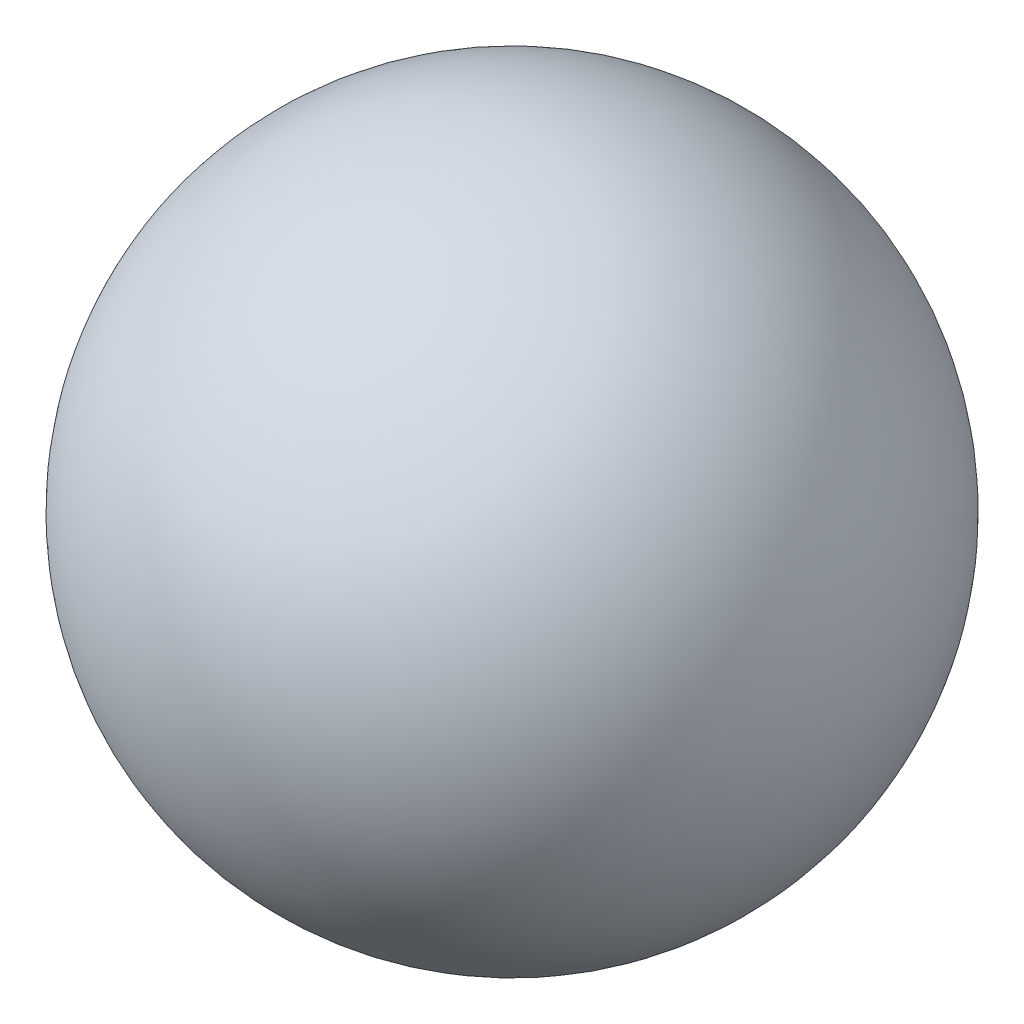
ISO-10303-21;
HEADER;
FILE_DESCRIPTION(('STEP AP214'),'2;1');
FILE_NAME('part.step','',(''),(''),'','','');
FILE_SCHEMA(('AUTOMOTIVE_DESIGN { 1 0 10303 214 1 1 1 1 }'));
ENDSEC;
DATA;
#1=APPLICATION_CONTEXT('core data for automotive mechanical design processes');
#2=APPLICATION_PROTOCOL_DEFINITION('international standard','automotive_design',2000,#1);
#3=PRODUCT_CONTEXT('',#1,'mechanical');
#4=PRODUCT('Part','Part','',(#3));
#5=PRODUCT_RELATED_PRODUCT_CATEGORY('part','',(#4));
#6=PRODUCT_DEFINITION_FORMATION('','',#4);
#7=PRODUCT_DEFINITION_CONTEXT('part definition',#1,'design');
#8=PRODUCT_DEFINITION('design','',#6,#7);
#9=PRODUCT_DEFINITION_SHAPE('','',#8);
#10=(LENGTH_UNIT() NAMED_UNIT(*) SI_UNIT(.MILLI.,.METRE.));
#11=(NAMED_UNIT(*) PLANE_ANGLE_UNIT() SI_UNIT($,.RADIAN.));
#12=(NAMED_UNIT(*) SI_UNIT($,.STERADIAN.) SOLID_ANGLE_UNIT());
#13=UNCERTAINTY_MEASURE_WITH_UNIT(LENGTH_MEASURE(1.E-05),#10,'distance_accuracy_value','');
#14=(GEOMETRIC_REPRESENTATION_CONTEXT(3) GLOBAL_UNCERTAINTY_ASSIGNED_CONTEXT((#13)) GLOBAL_UNIT_ASSIGNED_CONTEXT((#10,
#11,#12)) REPRESENTATION_CONTEXT('',''));
#15=CARTESIAN_POINT('',(0.,0.,0.));
#16=DIRECTION('',(0.,0.,1.));
#17=DIRECTION('',(1.,0.,0.));
#18=AXIS2_PLACEMENT_3D('',#15,#16,#17);
#19=CARTESIAN_POINT('',(0.,0.,0.));
#20=DIRECTION('',(1.,0.,0.));
#21=DIRECTION('',(0.,-1.,0.));
#22=AXIS2_PLACEMENT_3D('',#19,#20,#21);
#23=SPHERICAL_SURFACE('',#22,2.8);
#24=CARTESIAN_POINT('',(2.8,0.,0.));
#25=VERTEX_POINT('',#24);
#26=VERTEX_LOOP('',#25);
#27=FACE_BOUND('',#26,.T.);
#28=ADVANCED_FACE('F35',(#27),#23,.T.);
#29=CLOSED_SHELL('',(#28));
#30=MANIFOLD_SOLID_BREP('B2',#29);
#31=ADVANCED_BREP_SHAPE_REPRESENTATION('',(#18,#30),#14);
#32=SHAPE_DEFINITION_REPRESENTATION(#9,#31);
ENDSEC;
END-ISO-10303-21;
